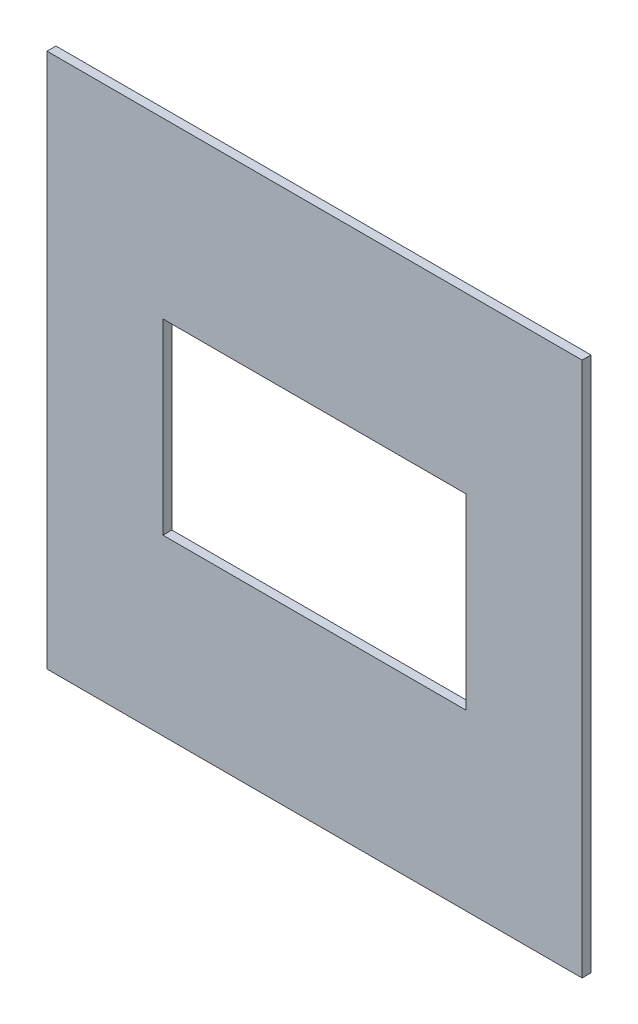
ISO-10303-21;
HEADER;
FILE_DESCRIPTION(('STEP AP214'),'2;1');
FILE_NAME('part.step','',(''),(''),'','','');
FILE_SCHEMA(('AUTOMOTIVE_DESIGN { 1 0 10303 214 1 1 1 1 }'));
ENDSEC;
DATA;
#1=APPLICATION_CONTEXT('core data for automotive mechanical design processes');
#2=APPLICATION_PROTOCOL_DEFINITION('international standard','automotive_design',2000,#1);
#3=PRODUCT_CONTEXT('',#1,'mechanical');
#4=PRODUCT('Part','Part','',(#3));
#5=PRODUCT_RELATED_PRODUCT_CATEGORY('part','',(#4));
#6=PRODUCT_DEFINITION_FORMATION('','',#4);
#7=PRODUCT_DEFINITION_CONTEXT('part definition',#1,'design');
#8=PRODUCT_DEFINITION('design','',#6,#7);
#9=PRODUCT_DEFINITION_SHAPE('','',#8);
#10=(LENGTH_UNIT() NAMED_UNIT(*) SI_UNIT(.MILLI.,.METRE.));
#11=(NAMED_UNIT(*) PLANE_ANGLE_UNIT() SI_UNIT($,.RADIAN.));
#12=(NAMED_UNIT(*) SI_UNIT($,.STERADIAN.) SOLID_ANGLE_UNIT());
#13=UNCERTAINTY_MEASURE_WITH_UNIT(LENGTH_MEASURE(1.E-05),#10,'distance_accuracy_value','');
#14=(GEOMETRIC_REPRESENTATION_CONTEXT(3) GLOBAL_UNCERTAINTY_ASSIGNED_CONTEXT((#13)) GLOBAL_UNIT_ASSIGNED_CONTEXT((#10,
#11,#12)) REPRESENTATION_CONTEXT('',''));
#15=CARTESIAN_POINT('',(0.,0.,0.));
#16=DIRECTION('',(0.,0.,1.));
#17=DIRECTION('',(1.,0.,0.));
#18=AXIS2_PLACEMENT_3D('',#15,#16,#17);
#19=CARTESIAN_POINT('',(0.,0.,5.));
#20=DIRECTION('',(0.,0.,1.));
#21=DIRECTION('',(1.,0.,0.));
#22=AXIS2_PLACEMENT_3D('',#19,#20,#21);
#23=PLANE('',#22);
#24=DIRECTION('',(0.,-1.,0.));
#25=VECTOR('',#24,1.);
#26=CARTESIAN_POINT('',(0.,300.,5.));
#27=LINE('',#26,#25);
#28=CARTESIAN_POINT('',(0.,300.,5.));
#29=VERTEX_POINT('',#28);
#30=CARTESIAN_POINT('',(0.,0.,5.));
#31=VERTEX_POINT('',#30);
#32=EDGE_CURVE('E134',#29,#31,#27,.T.);
#33=ORIENTED_EDGE('',*,*,#32,.T.);
#34=DIRECTION('',(1.,0.,0.));
#35=VECTOR('',#34,1.);
#36=CARTESIAN_POINT('',(0.,0.,5.));
#37=LINE('',#36,#35);
#38=CARTESIAN_POINT('',(300.,0.,5.));
#39=VERTEX_POINT('',#38);
#40=EDGE_CURVE('E137',#31,#39,#37,.T.);
#41=ORIENTED_EDGE('',*,*,#40,.T.);
#42=DIRECTION('',(0.,1.,0.));
#43=VECTOR('',#42,1.);
#44=CARTESIAN_POINT('',(300.,0.,5.));
#45=LINE('',#44,#43);
#46=CARTESIAN_POINT('',(300.,300.,5.));
#47=VERTEX_POINT('',#46);
#48=EDGE_CURVE('E140',#39,#47,#45,.T.);
#49=ORIENTED_EDGE('',*,*,#48,.T.);
#50=DIRECTION('',(-1.,0.,0.));
#51=VECTOR('',#50,1.);
#52=CARTESIAN_POINT('',(300.,300.,5.));
#53=LINE('',#52,#51);
#54=EDGE_CURVE('E142',#47,#29,#53,.T.);
#55=ORIENTED_EDGE('',*,*,#54,.T.);
#56=EDGE_LOOP('',(#33,#41,#49,#55));
#57=FACE_BOUND('',#56,.T.);
#58=DIRECTION('',(-1.,0.,0.));
#59=VECTOR('',#58,1.);
#60=CARTESIAN_POINT('',(235.,97.5,5.));
#61=LINE('',#60,#59);
#62=CARTESIAN_POINT('',(235.,97.5,5.));
#63=VERTEX_POINT('',#62);
#64=CARTESIAN_POINT('',(65.,97.5,5.));
#65=VERTEX_POINT('',#64);
#66=EDGE_CURVE('E106',#63,#65,#61,.T.);
#67=ORIENTED_EDGE('',*,*,#66,.T.);
#68=DIRECTION('',(0.,1.,0.));
#69=VECTOR('',#68,1.);
#70=CARTESIAN_POINT('',(65.,97.5,5.));
#71=LINE('',#70,#69);
#72=CARTESIAN_POINT('',(65.,202.5,5.));
#73=VERTEX_POINT('',#72);
#74=EDGE_CURVE('E47',#65,#73,#71,.T.);
#75=ORIENTED_EDGE('',*,*,#74,.T.);
#76=DIRECTION('',(1.,0.,0.));
#77=VECTOR('',#76,1.);
#78=CARTESIAN_POINT('',(65.,202.5,5.));
#79=LINE('',#78,#77);
#80=CARTESIAN_POINT('',(235.,202.5,5.));
#81=VERTEX_POINT('',#80);
#82=EDGE_CURVE('E112',#73,#81,#79,.T.);
#83=ORIENTED_EDGE('',*,*,#82,.T.);
#84=DIRECTION('',(0.,-1.,0.));
#85=VECTOR('',#84,1.);
#86=CARTESIAN_POINT('',(235.,202.5,5.));
#87=LINE('',#86,#85);
#88=EDGE_CURVE('E126',#81,#63,#87,.T.);
#89=ORIENTED_EDGE('',*,*,#88,.T.);
#90=EDGE_LOOP('',(#67,#75,#83,#89));
#91=FACE_BOUND('',#90,.T.);
#92=ADVANCED_FACE('F32',(#57,#91),#23,.T.);
#93=CARTESIAN_POINT('',(0.,0.,0.));
#94=DIRECTION('',(0.,0.,1.));
#95=DIRECTION('',(1.,0.,0.));
#96=AXIS2_PLACEMENT_3D('',#93,#94,#95);
#97=PLANE('',#96);
#98=DIRECTION('',(0.,-1.,0.));
#99=VECTOR('',#98,1.);
#100=CARTESIAN_POINT('',(0.,300.,0.));
#101=LINE('',#100,#99);
#102=CARTESIAN_POINT('',(0.,300.,0.));
#103=VERTEX_POINT('',#102);
#104=CARTESIAN_POINT('',(0.,0.,0.));
#105=VERTEX_POINT('',#104);
#106=EDGE_CURVE('E113',#103,#105,#101,.T.);
#107=ORIENTED_EDGE('',*,*,#106,.F.);
#108=DIRECTION('',(-1.,0.,0.));
#109=VECTOR('',#108,1.);
#110=CARTESIAN_POINT('',(300.,300.,0.));
#111=LINE('',#110,#109);
#112=CARTESIAN_POINT('',(300.,300.,0.));
#113=VERTEX_POINT('',#112);
#114=EDGE_CURVE('E138',#113,#103,#111,.T.);
#115=ORIENTED_EDGE('',*,*,#114,.F.);
#116=DIRECTION('',(0.,1.,0.));
#117=VECTOR('',#116,1.);
#118=CARTESIAN_POINT('',(300.,0.,0.));
#119=LINE('',#118,#117);
#120=CARTESIAN_POINT('',(300.,0.,0.));
#121=VERTEX_POINT('',#120);
#122=EDGE_CURVE('E149',#121,#113,#119,.T.);
#123=ORIENTED_EDGE('',*,*,#122,.F.);
#124=DIRECTION('',(1.,0.,0.));
#125=VECTOR('',#124,1.);
#126=CARTESIAN_POINT('',(0.,0.,0.));
#127=LINE('',#126,#125);
#128=EDGE_CURVE('E147',#105,#121,#127,.T.);
#129=ORIENTED_EDGE('',*,*,#128,.F.);
#130=EDGE_LOOP('',(#107,#115,#123,#129));
#131=FACE_BOUND('',#130,.T.);
#132=DIRECTION('',(0.,1.,0.));
#133=VECTOR('',#132,1.);
#134=CARTESIAN_POINT('',(65.,97.5,0.));
#135=LINE('',#134,#133);
#136=CARTESIAN_POINT('',(65.,97.5,0.));
#137=VERTEX_POINT('',#136);
#138=CARTESIAN_POINT('',(65.,202.5,0.));
#139=VERTEX_POINT('',#138);
#140=EDGE_CURVE('E97',#137,#139,#135,.T.);
#141=ORIENTED_EDGE('',*,*,#140,.F.);
#142=DIRECTION('',(-1.,0.,0.));
#143=VECTOR('',#142,1.);
#144=CARTESIAN_POINT('',(235.,97.5,0.));
#145=LINE('',#144,#143);
#146=CARTESIAN_POINT('',(235.,97.5,0.));
#147=VERTEX_POINT('',#146);
#148=EDGE_CURVE('E120',#147,#137,#145,.T.);
#149=ORIENTED_EDGE('',*,*,#148,.F.);
#150=DIRECTION('',(0.,-1.,0.));
#151=VECTOR('',#150,1.);
#152=CARTESIAN_POINT('',(235.,202.5,0.));
#153=LINE('',#152,#151);
#154=CARTESIAN_POINT('',(235.,202.5,0.));
#155=VERTEX_POINT('',#154);
#156=EDGE_CURVE('E118',#155,#147,#153,.T.);
#157=ORIENTED_EDGE('',*,*,#156,.F.);
#158=DIRECTION('',(1.,0.,0.));
#159=VECTOR('',#158,1.);
#160=CARTESIAN_POINT('',(65.,202.5,0.));
#161=LINE('',#160,#159);
#162=EDGE_CURVE('E105',#139,#155,#161,.T.);
#163=ORIENTED_EDGE('',*,*,#162,.F.);
#164=EDGE_LOOP('',(#141,#149,#157,#163));
#165=FACE_BOUND('',#164,.T.);
#166=ADVANCED_FACE('F117',(#131,#165),#97,.F.);
#167=CARTESIAN_POINT('',(0.,300.,5.));
#168=DIRECTION('',(1.,0.,0.));
#169=DIRECTION('',(0.,0.,-1.));
#170=AXIS2_PLACEMENT_3D('',#167,#168,#169);
#171=PLANE('',#170);
#172=ORIENTED_EDGE('',*,*,#106,.T.);
#173=DIRECTION('',(0.,0.,-1.));
#174=VECTOR('',#173,1.);
#175=CARTESIAN_POINT('',(0.,0.,5.));
#176=LINE('',#175,#174);
#177=EDGE_CURVE('E11',#31,#105,#176,.T.);
#178=ORIENTED_EDGE('',*,*,#177,.F.);
#179=ORIENTED_EDGE('',*,*,#32,.F.);
#180=DIRECTION('',(0.,0.,-1.));
#181=VECTOR('',#180,1.);
#182=CARTESIAN_POINT('',(0.,300.,5.));
#183=LINE('',#182,#181);
#184=EDGE_CURVE('E144',#29,#103,#183,.T.);
#185=ORIENTED_EDGE('',*,*,#184,.T.);
#186=EDGE_LOOP('',(#172,#178,#179,#185));
#187=FACE_BOUND('',#186,.T.);
#188=ADVANCED_FACE('F34',(#187),#171,.F.);
#189=CARTESIAN_POINT('',(0.,0.,5.));
#190=DIRECTION('',(0.,1.,0.));
#191=DIRECTION('',(0.,0.,1.));
#192=AXIS2_PLACEMENT_3D('',#189,#190,#191);
#193=PLANE('',#192);
#194=ORIENTED_EDGE('',*,*,#128,.T.);
#195=DIRECTION('',(0.,0.,-1.));
#196=VECTOR('',#195,1.);
#197=CARTESIAN_POINT('',(300.,0.,5.));
#198=LINE('',#197,#196);
#199=EDGE_CURVE('E40',#39,#121,#198,.T.);
#200=ORIENTED_EDGE('',*,*,#199,.F.);
#201=ORIENTED_EDGE('',*,*,#40,.F.);
#202=ORIENTED_EDGE('',*,*,#177,.T.);
#203=EDGE_LOOP('',(#194,#200,#201,#202));
#204=FACE_BOUND('',#203,.T.);
#205=ADVANCED_FACE('F176',(#204),#193,.F.);
#206=CARTESIAN_POINT('',(300.,0.,5.));
#207=DIRECTION('',(-1.,0.,0.));
#208=DIRECTION('',(0.,0.,1.));
#209=AXIS2_PLACEMENT_3D('',#206,#207,#208);
#210=PLANE('',#209);
#211=ORIENTED_EDGE('',*,*,#122,.T.);
#212=DIRECTION('',(0.,0.,-1.));
#213=VECTOR('',#212,1.);
#214=CARTESIAN_POINT('',(300.,300.,5.));
#215=LINE('',#214,#213);
#216=EDGE_CURVE('E154',#47,#113,#215,.T.);
#217=ORIENTED_EDGE('',*,*,#216,.F.);
#218=ORIENTED_EDGE('',*,*,#48,.F.);
#219=ORIENTED_EDGE('',*,*,#199,.T.);
#220=EDGE_LOOP('',(#211,#217,#218,#219));
#221=FACE_BOUND('',#220,.T.);
#222=ADVANCED_FACE('F161',(#221),#210,.F.);
#223=CARTESIAN_POINT('',(300.,300.,5.));
#224=DIRECTION('',(0.,-1.,0.));
#225=DIRECTION('',(1.,0.,0.));
#226=AXIS2_PLACEMENT_3D('',#223,#224,#225);
#227=PLANE('',#226);
#228=ORIENTED_EDGE('',*,*,#114,.T.);
#229=ORIENTED_EDGE('',*,*,#184,.F.);
#230=ORIENTED_EDGE('',*,*,#54,.F.);
#231=ORIENTED_EDGE('',*,*,#216,.T.);
#232=EDGE_LOOP('',(#228,#229,#230,#231));
#233=FACE_BOUND('',#232,.T.);
#234=ADVANCED_FACE('F169',(#233),#227,.F.);
#235=CARTESIAN_POINT('',(65.,97.5,0.));
#236=DIRECTION('',(1.,0.,0.));
#237=DIRECTION('',(0.,1.,0.));
#238=AXIS2_PLACEMENT_3D('',#235,#236,#237);
#239=PLANE('',#238);
#240=ORIENTED_EDGE('',*,*,#74,.F.);
#241=DIRECTION('',(0.,0.,1.));
#242=VECTOR('',#241,1.);
#243=CARTESIAN_POINT('',(65.,97.5,0.));
#244=LINE('',#243,#242);
#245=EDGE_CURVE('E101',#137,#65,#244,.T.);
#246=ORIENTED_EDGE('',*,*,#245,.F.);
#247=ORIENTED_EDGE('',*,*,#140,.T.);
#248=DIRECTION('',(0.,0.,1.));
#249=VECTOR('',#248,1.);
#250=CARTESIAN_POINT('',(65.,202.5,0.));
#251=LINE('',#250,#249);
#252=EDGE_CURVE('E100',#139,#73,#251,.T.);
#253=ORIENTED_EDGE('',*,*,#252,.T.);
#254=EDGE_LOOP('',(#240,#246,#247,#253));
#255=FACE_BOUND('',#254,.T.);
#256=ADVANCED_FACE('F99',(#255),#239,.T.);
#257=CARTESIAN_POINT('',(65.,202.5,0.));
#258=DIRECTION('',(0.,-1.,0.));
#259=DIRECTION('',(0.,0.,-1.));
#260=AXIS2_PLACEMENT_3D('',#257,#258,#259);
#261=PLANE('',#260);
#262=ORIENTED_EDGE('',*,*,#82,.F.);
#263=ORIENTED_EDGE('',*,*,#252,.F.);
#264=ORIENTED_EDGE('',*,*,#162,.T.);
#265=DIRECTION('',(0.,0.,1.));
#266=VECTOR('',#265,1.);
#267=CARTESIAN_POINT('',(235.,202.5,0.));
#268=LINE('',#267,#266);
#269=EDGE_CURVE('E114',#155,#81,#268,.T.);
#270=ORIENTED_EDGE('',*,*,#269,.T.);
#271=EDGE_LOOP('',(#262,#263,#264,#270));
#272=FACE_BOUND('',#271,.T.);
#273=ADVANCED_FACE('F109',(#272),#261,.T.);
#274=CARTESIAN_POINT('',(235.,202.5,0.));
#275=DIRECTION('',(-1.,0.,0.));
#276=DIRECTION('',(0.,0.,1.));
#277=AXIS2_PLACEMENT_3D('',#274,#275,#276);
#278=PLANE('',#277);
#279=ORIENTED_EDGE('',*,*,#88,.F.);
#280=ORIENTED_EDGE('',*,*,#269,.F.);
#281=ORIENTED_EDGE('',*,*,#156,.T.);
#282=DIRECTION('',(0.,0.,1.));
#283=VECTOR('',#282,1.);
#284=CARTESIAN_POINT('',(235.,97.5,0.));
#285=LINE('',#284,#283);
#286=EDGE_CURVE('E55',#147,#63,#285,.T.);
#287=ORIENTED_EDGE('',*,*,#286,.T.);
#288=EDGE_LOOP('',(#279,#280,#281,#287));
#289=FACE_BOUND('',#288,.T.);
#290=ADVANCED_FACE('F199',(#289),#278,.T.);
#291=CARTESIAN_POINT('',(235.,97.5,0.));
#292=DIRECTION('',(0.,1.,0.));
#293=DIRECTION('',(-1.,0.,0.));
#294=AXIS2_PLACEMENT_3D('',#291,#292,#293);
#295=PLANE('',#294);
#296=ORIENTED_EDGE('',*,*,#66,.F.);
#297=ORIENTED_EDGE('',*,*,#286,.F.);
#298=ORIENTED_EDGE('',*,*,#148,.T.);
#299=ORIENTED_EDGE('',*,*,#245,.T.);
#300=EDGE_LOOP('',(#296,#297,#298,#299));
#301=FACE_BOUND('',#300,.T.);
#302=ADVANCED_FACE('F203',(#301),#295,.T.);
#303=CLOSED_SHELL('',(#92,#166,#188,#205,#222,#234,#256,#273,#290,#302));
#304=MANIFOLD_SOLID_BREP('B2',#303);
#305=ADVANCED_BREP_SHAPE_REPRESENTATION('',(#18,#304),#14);
#306=SHAPE_DEFINITION_REPRESENTATION(#9,#305);
ENDSEC;
END-ISO-10303-21;
